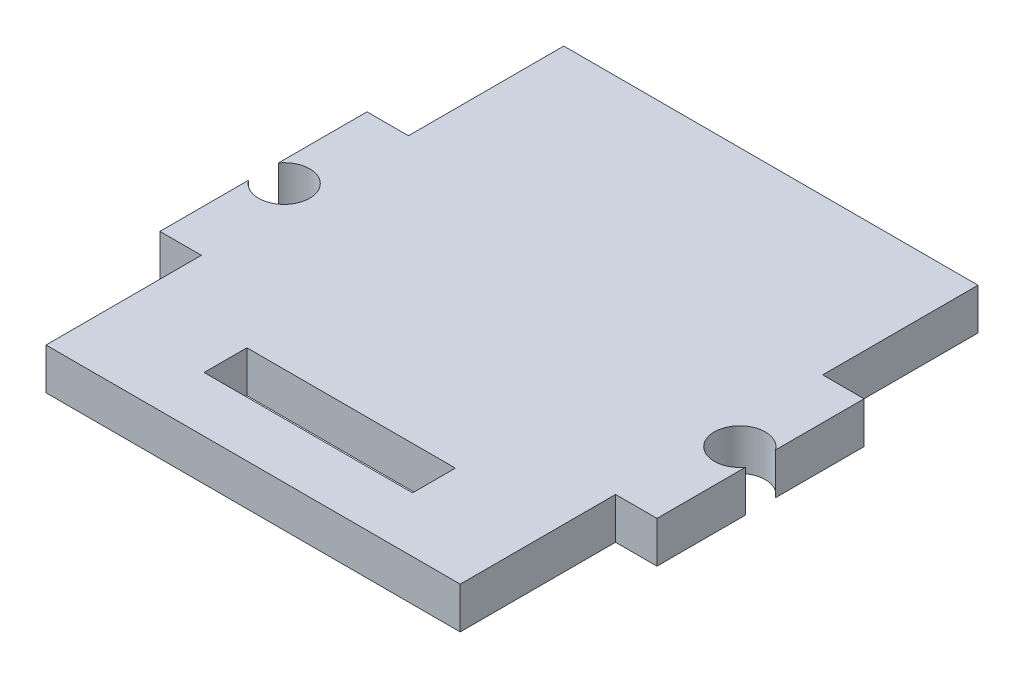
ISO-10303-21;
HEADER;
FILE_DESCRIPTION(('STEP AP214'),'2;1');
FILE_NAME('part.step','',(''),(''),'','','');
FILE_SCHEMA(('AUTOMOTIVE_DESIGN { 1 0 10303 214 1 1 1 1 }'));
ENDSEC;
DATA;
#1=APPLICATION_CONTEXT('core data for automotive mechanical design processes');
#2=APPLICATION_PROTOCOL_DEFINITION('international standard','automotive_design',2000,#1);
#3=PRODUCT_CONTEXT('',#1,'mechanical');
#4=PRODUCT('Part','Part','',(#3));
#5=PRODUCT_RELATED_PRODUCT_CATEGORY('part','',(#4));
#6=PRODUCT_DEFINITION_FORMATION('','',#4);
#7=PRODUCT_DEFINITION_CONTEXT('part definition',#1,'design');
#8=PRODUCT_DEFINITION('design','',#6,#7);
#9=PRODUCT_DEFINITION_SHAPE('','',#8);
#10=(LENGTH_UNIT() NAMED_UNIT(*) SI_UNIT(.MILLI.,.METRE.));
#11=(NAMED_UNIT(*) PLANE_ANGLE_UNIT() SI_UNIT($,.RADIAN.));
#12=(NAMED_UNIT(*) SI_UNIT($,.STERADIAN.) SOLID_ANGLE_UNIT());
#13=UNCERTAINTY_MEASURE_WITH_UNIT(LENGTH_MEASURE(1.E-05),#10,'distance_accuracy_value','');
#14=(GEOMETRIC_REPRESENTATION_CONTEXT(3) GLOBAL_UNCERTAINTY_ASSIGNED_CONTEXT((#13)) GLOBAL_UNIT_ASSIGNED_CONTEXT((#10,
#11,#12)) REPRESENTATION_CONTEXT('',''));
#15=CARTESIAN_POINT('',(0.,0.,0.));
#16=DIRECTION('',(0.,0.,1.));
#17=DIRECTION('',(1.,0.,0.));
#18=AXIS2_PLACEMENT_3D('',#15,#16,#17);
#19=CARTESIAN_POINT('',(18.,0.,7.5));
#20=DIRECTION('',(1.,0.,0.));
#21=DIRECTION('',(0.,0.,-1.));
#22=AXIS2_PLACEMENT_3D('',#19,#20,#21);
#23=PLANE('',#22);
#24=DIRECTION('',(0.,1.,0.));
#25=VECTOR('',#24,1.);
#26=CARTESIAN_POINT('',(18.,-5.00000000001367E-05,-1.08282039138535));
#27=LINE('',#26,#25);
#28=CARTESIAN_POINT('',(18.,0.,-1.08282039138535));
#29=VERTEX_POINT('',#28);
#30=CARTESIAN_POINT('',(18.,3.,-1.08282039138535));
#31=VERTEX_POINT('',#30);
#32=EDGE_CURVE('E246',#29,#31,#27,.T.);
#33=ORIENTED_EDGE('',*,*,#32,.F.);
#34=DIRECTION('',(0.,0.,-1.));
#35=VECTOR('',#34,1.);
#36=CARTESIAN_POINT('',(18.,0.,7.5));
#37=LINE('',#36,#35);
#38=CARTESIAN_POINT('',(18.,0.,-7.5));
#39=VERTEX_POINT('',#38);
#40=EDGE_CURVE('E213',#29,#39,#37,.T.);
#41=ORIENTED_EDGE('',*,*,#40,.T.);
#42=DIRECTION('',(0.,1.,0.));
#43=VECTOR('',#42,1.);
#44=CARTESIAN_POINT('',(18.,0.,-7.5));
#45=LINE('',#44,#43);
#46=CARTESIAN_POINT('',(18.,3.,-7.5));
#47=VERTEX_POINT('',#46);
#48=EDGE_CURVE('E221',#39,#47,#45,.T.);
#49=ORIENTED_EDGE('',*,*,#48,.T.);
#50=DIRECTION('',(0.,0.,-1.));
#51=VECTOR('',#50,1.);
#52=CARTESIAN_POINT('',(18.,3.,7.5));
#53=LINE('',#52,#51);
#54=EDGE_CURVE('E218',#31,#47,#53,.T.);
#55=ORIENTED_EDGE('',*,*,#54,.F.);
#56=EDGE_LOOP('',(#33,#41,#49,#55));
#57=FACE_BOUND('',#56,.T.);
#58=ADVANCED_FACE('F33',(#57),#23,.T.);
#59=CARTESIAN_POINT('',(-18.,0.,7.5));
#60=DIRECTION('',(-1.,0.,0.));
#61=DIRECTION('',(0.,0.,1.));
#62=AXIS2_PLACEMENT_3D('',#59,#60,#61);
#63=PLANE('',#62);
#64=DIRECTION('',(0.,1.,0.));
#65=VECTOR('',#64,1.);
#66=CARTESIAN_POINT('',(-18.,-5.00000000001367E-05,1.08282039138538));
#67=LINE('',#66,#65);
#68=CARTESIAN_POINT('',(-18.,0.,1.08282039138538));
#69=VERTEX_POINT('',#68);
#70=CARTESIAN_POINT('',(-18.,3.,1.08282039138538));
#71=VERTEX_POINT('',#70);
#72=EDGE_CURVE('E241',#69,#71,#67,.T.);
#73=ORIENTED_EDGE('',*,*,#72,.F.);
#74=DIRECTION('',(0.,0.,1.));
#75=VECTOR('',#74,1.);
#76=CARTESIAN_POINT('',(-18.,0.,7.5));
#77=LINE('',#76,#75);
#78=CARTESIAN_POINT('',(-18.,0.,7.5));
#79=VERTEX_POINT('',#78);
#80=EDGE_CURVE('E322',#69,#79,#77,.T.);
#81=ORIENTED_EDGE('',*,*,#80,.T.);
#82=DIRECTION('',(0.,1.,0.));
#83=VECTOR('',#82,1.);
#84=CARTESIAN_POINT('',(-18.,0.,7.5));
#85=LINE('',#84,#83);
#86=CARTESIAN_POINT('',(-18.,3.,7.5));
#87=VERTEX_POINT('',#86);
#88=EDGE_CURVE('E330',#79,#87,#85,.T.);
#89=ORIENTED_EDGE('',*,*,#88,.T.);
#90=DIRECTION('',(0.,0.,1.));
#91=VECTOR('',#90,1.);
#92=CARTESIAN_POINT('',(-18.,3.,7.5));
#93=LINE('',#92,#91);
#94=EDGE_CURVE('E327',#71,#87,#93,.T.);
#95=ORIENTED_EDGE('',*,*,#94,.F.);
#96=EDGE_LOOP('',(#73,#81,#89,#95));
#97=FACE_BOUND('',#96,.T.);
#98=ADVANCED_FACE('F271',(#97),#63,.T.);
#99=CARTESIAN_POINT('',(15.,3.,-18.75));
#100=DIRECTION('',(-1.,0.,0.));
#101=DIRECTION('',(0.,0.,1.));
#102=AXIS2_PLACEMENT_3D('',#99,#100,#101);
#103=PLANE('',#102);
#104=DIRECTION('',(0.,1.,0.));
#105=VECTOR('',#104,1.);
#106=CARTESIAN_POINT('',(15.,0.,-7.5));
#107=LINE('',#106,#105);
#108=CARTESIAN_POINT('',(15.,0.,-7.5));
#109=VERTEX_POINT('',#108);
#110=CARTESIAN_POINT('',(15.,3.,-7.5));
#111=VERTEX_POINT('',#110);
#112=EDGE_CURVE('E224',#109,#111,#107,.T.);
#113=ORIENTED_EDGE('',*,*,#112,.F.);
#114=DIRECTION('',(0.,0.,-1.));
#115=VECTOR('',#114,1.);
#116=CARTESIAN_POINT('',(15.,0.,-18.75));
#117=LINE('',#116,#115);
#118=CARTESIAN_POINT('',(15.,0.,-18.75));
#119=VERTEX_POINT('',#118);
#120=EDGE_CURVE('E336',#109,#119,#117,.T.);
#121=ORIENTED_EDGE('',*,*,#120,.T.);
#122=DIRECTION('',(0.,-1.,0.));
#123=VECTOR('',#122,1.);
#124=CARTESIAN_POINT('',(15.,3.,-18.75));
#125=LINE('',#124,#123);
#126=CARTESIAN_POINT('',(15.,3.,-18.75));
#127=VERTEX_POINT('',#126);
#128=EDGE_CURVE('E242',#127,#119,#125,.T.);
#129=ORIENTED_EDGE('',*,*,#128,.F.);
#130=DIRECTION('',(0.,0.,-1.));
#131=VECTOR('',#130,1.);
#132=CARTESIAN_POINT('',(15.,3.,-18.75));
#133=LINE('',#132,#131);
#134=EDGE_CURVE('E309',#111,#127,#133,.T.);
#135=ORIENTED_EDGE('',*,*,#134,.F.);
#136=EDGE_LOOP('',(#113,#121,#129,#135));
#137=FACE_BOUND('',#136,.T.);
#138=ADVANCED_FACE('F278',(#137),#103,.F.);
#139=CARTESIAN_POINT('',(-15.,3.,-18.75));
#140=DIRECTION('',(1.,0.,0.));
#141=DIRECTION('',(0.,0.,-1.));
#142=AXIS2_PLACEMENT_3D('',#139,#140,#141);
#143=PLANE('',#142);
#144=DIRECTION('',(0.,1.,0.));
#145=VECTOR('',#144,1.);
#146=CARTESIAN_POINT('',(-15.,0.,7.5));
#147=LINE('',#146,#145);
#148=CARTESIAN_POINT('',(-15.,0.,7.5));
#149=VERTEX_POINT('',#148);
#150=CARTESIAN_POINT('',(-15.,3.,7.5));
#151=VERTEX_POINT('',#150);
#152=EDGE_CURVE('E333',#149,#151,#147,.T.);
#153=ORIENTED_EDGE('',*,*,#152,.F.);
#154=DIRECTION('',(0.,0.,1.));
#155=VECTOR('',#154,1.);
#156=CARTESIAN_POINT('',(-15.,0.,-18.75));
#157=LINE('',#156,#155);
#158=CARTESIAN_POINT('',(-15.,0.,18.75));
#159=VERTEX_POINT('',#158);
#160=EDGE_CURVE('E360',#149,#159,#157,.T.);
#161=ORIENTED_EDGE('',*,*,#160,.T.);
#162=DIRECTION('',(0.,-1.,0.));
#163=VECTOR('',#162,1.);
#164=CARTESIAN_POINT('',(-15.,3.,18.75));
#165=LINE('',#164,#163);
#166=CARTESIAN_POINT('',(-15.,3.,18.75));
#167=VERTEX_POINT('',#166);
#168=EDGE_CURVE('E377',#167,#159,#165,.T.);
#169=ORIENTED_EDGE('',*,*,#168,.F.);
#170=DIRECTION('',(0.,0.,1.));
#171=VECTOR('',#170,1.);
#172=CARTESIAN_POINT('',(-15.,3.,-18.75));
#173=LINE('',#172,#171);
#174=EDGE_CURVE('E387',#151,#167,#173,.T.);
#175=ORIENTED_EDGE('',*,*,#174,.F.);
#176=EDGE_LOOP('',(#153,#161,#169,#175));
#177=FACE_BOUND('',#176,.T.);
#178=ADVANCED_FACE('F446',(#177),#143,.F.);
#179=CARTESIAN_POINT('',(15.,0.,18.75));
#180=VERTEX_POINT('',#179);
#181=CARTESIAN_POINT('',(15.,0.,7.50000000000001));
#182=VERTEX_POINT('',#181);
#183=EDGE_CURVE('E348',#180,#182,#117,.T.);
#184=ORIENTED_EDGE('',*,*,#183,.T.);
#185=DIRECTION('',(0.,1.,0.));
#186=VECTOR('',#185,1.);
#187=CARTESIAN_POINT('',(15.,0.,7.50000000000001));
#188=LINE('',#187,#186);
#189=CARTESIAN_POINT('',(15.,3.,7.50000000000001));
#190=VERTEX_POINT('',#189);
#191=EDGE_CURVE('E231',#182,#190,#188,.T.);
#192=ORIENTED_EDGE('',*,*,#191,.T.);
#193=CARTESIAN_POINT('',(15.,3.,18.75));
#194=VERTEX_POINT('',#193);
#195=EDGE_CURVE('E304',#194,#190,#133,.T.);
#196=ORIENTED_EDGE('',*,*,#195,.F.);
#197=DIRECTION('',(0.,-1.,0.));
#198=VECTOR('',#197,1.);
#199=CARTESIAN_POINT('',(15.,3.,18.75));
#200=LINE('',#199,#198);
#201=EDGE_CURVE('E379',#194,#180,#200,.T.);
#202=ORIENTED_EDGE('',*,*,#201,.T.);
#203=EDGE_LOOP('',(#184,#192,#196,#202));
#204=FACE_BOUND('',#203,.T.);
#205=ADVANCED_FACE('F35',(#204),#103,.F.);
#206=CARTESIAN_POINT('',(-15.,3.,-18.75));
#207=DIRECTION('',(0.,0.,1.));
#208=DIRECTION('',(1.,0.,0.));
#209=AXIS2_PLACEMENT_3D('',#206,#207,#208);
#210=PLANE('',#209);
#211=DIRECTION('',(-1.,0.,0.));
#212=VECTOR('',#211,1.);
#213=CARTESIAN_POINT('',(-15.,0.,-18.75));
#214=LINE('',#213,#212);
#215=CARTESIAN_POINT('',(-15.,0.,-18.75));
#216=VERTEX_POINT('',#215);
#217=EDGE_CURVE('E352',#119,#216,#214,.T.);
#218=ORIENTED_EDGE('',*,*,#217,.T.);
#219=DIRECTION('',(0.,-1.,0.));
#220=VECTOR('',#219,1.);
#221=CARTESIAN_POINT('',(-15.,3.,-18.75));
#222=LINE('',#221,#220);
#223=CARTESIAN_POINT('',(-15.,3.,-18.75));
#224=VERTEX_POINT('',#223);
#225=EDGE_CURVE('E374',#224,#216,#222,.T.);
#226=ORIENTED_EDGE('',*,*,#225,.F.);
#227=DIRECTION('',(-1.,0.,0.));
#228=VECTOR('',#227,1.);
#229=CARTESIAN_POINT('',(-15.,3.,-18.75));
#230=LINE('',#229,#228);
#231=EDGE_CURVE('E390',#127,#224,#230,.T.);
#232=ORIENTED_EDGE('',*,*,#231,.F.);
#233=ORIENTED_EDGE('',*,*,#128,.T.);
#234=EDGE_LOOP('',(#218,#226,#232,#233));
#235=FACE_BOUND('',#234,.T.);
#236=ADVANCED_FACE('F422',(#235),#210,.F.);
#237=CARTESIAN_POINT('',(-15.,0.,-7.5));
#238=VERTEX_POINT('',#237);
#239=EDGE_CURVE('E369',#216,#238,#157,.T.);
#240=ORIENTED_EDGE('',*,*,#239,.T.);
#241=DIRECTION('',(0.,1.,0.));
#242=VECTOR('',#241,1.);
#243=CARTESIAN_POINT('',(-15.,0.,-7.5));
#244=LINE('',#243,#242);
#245=CARTESIAN_POINT('',(-15.,3.,-7.5));
#246=VERTEX_POINT('',#245);
#247=EDGE_CURVE('E340',#238,#246,#244,.T.);
#248=ORIENTED_EDGE('',*,*,#247,.T.);
#249=EDGE_CURVE('E384',#224,#246,#173,.T.);
#250=ORIENTED_EDGE('',*,*,#249,.F.);
#251=ORIENTED_EDGE('',*,*,#225,.T.);
#252=EDGE_LOOP('',(#240,#248,#250,#251));
#253=FACE_BOUND('',#252,.T.);
#254=ADVANCED_FACE('F426',(#253),#143,.F.);
#255=CARTESIAN_POINT('',(-15.,3.,18.75));
#256=DIRECTION('',(0.,0.,-1.));
#257=DIRECTION('',(-1.,0.,0.));
#258=AXIS2_PLACEMENT_3D('',#255,#256,#257);
#259=PLANE('',#258);
#260=DIRECTION('',(1.,0.,0.));
#261=VECTOR('',#260,1.);
#262=CARTESIAN_POINT('',(-15.,0.,18.75));
#263=LINE('',#262,#261);
#264=EDGE_CURVE('E363',#159,#180,#263,.T.);
#265=ORIENTED_EDGE('',*,*,#264,.T.);
#266=ORIENTED_EDGE('',*,*,#201,.F.);
#267=DIRECTION('',(1.,0.,0.));
#268=VECTOR('',#267,1.);
#269=CARTESIAN_POINT('',(-15.,3.,18.75));
#270=LINE('',#269,#268);
#271=EDGE_CURVE('E356',#167,#194,#270,.T.);
#272=ORIENTED_EDGE('',*,*,#271,.F.);
#273=ORIENTED_EDGE('',*,*,#168,.T.);
#274=EDGE_LOOP('',(#265,#266,#272,#273));
#275=FACE_BOUND('',#274,.T.);
#276=ADVANCED_FACE('F404',(#275),#259,.F.);
#277=CARTESIAN_POINT('',(0.,3.,0.));
#278=DIRECTION('',(0.,1.,0.));
#279=DIRECTION('',(0.,0.,1.));
#280=AXIS2_PLACEMENT_3D('',#277,#278,#279);
#281=PLANE('',#280);
#282=DIRECTION('',(0.,0.,1.));
#283=VECTOR('',#282,1.);
#284=CARTESIAN_POINT('',(-7.55,3.,14.75));
#285=LINE('',#284,#283);
#286=CARTESIAN_POINT('',(-7.55,3.,11.65));
#287=VERTEX_POINT('',#286);
#288=CARTESIAN_POINT('',(-7.55,3.,14.75));
#289=VERTEX_POINT('',#288);
#290=EDGE_CURVE('E48',#287,#289,#285,.T.);
#291=ORIENTED_EDGE('',*,*,#290,.F.);
#292=DIRECTION('',(-1.,0.,0.));
#293=VECTOR('',#292,1.);
#294=CARTESIAN_POINT('',(-7.55,3.,11.65));
#295=LINE('',#294,#293);
#296=CARTESIAN_POINT('',(7.55,3.,11.65));
#297=VERTEX_POINT('',#296);
#298=EDGE_CURVE('E189',#297,#287,#295,.T.);
#299=ORIENTED_EDGE('',*,*,#298,.F.);
#300=DIRECTION('',(0.,0.,-1.));
#301=VECTOR('',#300,1.);
#302=CARTESIAN_POINT('',(7.55,3.,14.75));
#303=LINE('',#302,#301);
#304=CARTESIAN_POINT('',(7.55,3.,14.75));
#305=VERTEX_POINT('',#304);
#306=EDGE_CURVE('E173',#305,#297,#303,.T.);
#307=ORIENTED_EDGE('',*,*,#306,.F.);
#308=DIRECTION('',(1.,0.,0.));
#309=VECTOR('',#308,1.);
#310=CARTESIAN_POINT('',(-7.55,3.,14.75));
#311=LINE('',#310,#309);
#312=EDGE_CURVE('E182',#289,#305,#311,.T.);
#313=ORIENTED_EDGE('',*,*,#312,.F.);
#314=EDGE_LOOP('',(#291,#299,#307,#313));
#315=FACE_BOUND('',#314,.T.);
#316=CARTESIAN_POINT('',(16.5,3.,0.));
#317=DIRECTION('',(0.,1.,0.));
#318=DIRECTION('',(0.,0.,1.));
#319=AXIS2_PLACEMENT_3D('',#316,#317,#318);
#320=CIRCLE('',#319,1.85);
#321=CARTESIAN_POINT('',(18.,3.,1.08282039138535));
#322=VERTEX_POINT('',#321);
#323=EDGE_CURVE('E196',#31,#322,#320,.T.);
#324=ORIENTED_EDGE('',*,*,#323,.F.);
#325=ORIENTED_EDGE('',*,*,#54,.T.);
#326=DIRECTION('',(-1.,0.,0.));
#327=VECTOR('',#326,1.);
#328=CARTESIAN_POINT('',(15.,3.,-7.5));
#329=LINE('',#328,#327);
#330=EDGE_CURVE('E217',#47,#111,#329,.T.);
#331=ORIENTED_EDGE('',*,*,#330,.T.);
#332=ORIENTED_EDGE('',*,*,#134,.T.);
#333=ORIENTED_EDGE('',*,*,#231,.T.);
#334=ORIENTED_EDGE('',*,*,#249,.T.);
#335=DIRECTION('',(-1.,0.,0.));
#336=VECTOR('',#335,1.);
#337=CARTESIAN_POINT('',(-15.,3.,-7.5));
#338=LINE('',#337,#336);
#339=CARTESIAN_POINT('',(-18.,3.,-7.5));
#340=VERTEX_POINT('',#339);
#341=EDGE_CURVE('E227',#246,#340,#338,.T.);
#342=ORIENTED_EDGE('',*,*,#341,.T.);
#343=CARTESIAN_POINT('',(-18.,3.,-1.08282039138538));
#344=VERTEX_POINT('',#343);
#345=EDGE_CURVE('E323',#340,#344,#93,.T.);
#346=ORIENTED_EDGE('',*,*,#345,.T.);
#347=CARTESIAN_POINT('',(-16.5,3.,0.));
#348=DIRECTION('',(0.,1.,0.));
#349=DIRECTION('',(0.,0.,1.));
#350=AXIS2_PLACEMENT_3D('',#347,#348,#349);
#351=CIRCLE('',#350,1.85);
#352=EDGE_CURVE('E203',#71,#344,#351,.T.);
#353=ORIENTED_EDGE('',*,*,#352,.F.);
#354=ORIENTED_EDGE('',*,*,#94,.T.);
#355=DIRECTION('',(1.,0.,0.));
#356=VECTOR('',#355,1.);
#357=CARTESIAN_POINT('',(-15.,3.,7.5));
#358=LINE('',#357,#356);
#359=EDGE_CURVE('E326',#87,#151,#358,.T.);
#360=ORIENTED_EDGE('',*,*,#359,.T.);
#361=ORIENTED_EDGE('',*,*,#174,.T.);
#362=ORIENTED_EDGE('',*,*,#271,.T.);
#363=ORIENTED_EDGE('',*,*,#195,.T.);
#364=DIRECTION('',(1.,0.,0.));
#365=VECTOR('',#364,1.);
#366=CARTESIAN_POINT('',(15.,3.,7.50000000000001));
#367=LINE('',#366,#365);
#368=CARTESIAN_POINT('',(18.,3.,7.5));
#369=VERTEX_POINT('',#368);
#370=EDGE_CURVE('E208',#190,#369,#367,.T.);
#371=ORIENTED_EDGE('',*,*,#370,.T.);
#372=EDGE_CURVE('E214',#369,#322,#53,.T.);
#373=ORIENTED_EDGE('',*,*,#372,.T.);
#374=EDGE_LOOP('',(#324,#325,#331,#332,#333,#334,#342,#346,#353,#354,#360,#361,#362,#363,#371,#373));
#375=FACE_BOUND('',#374,.T.);
#376=ADVANCED_FACE('F186',(#315,#375),#281,.T.);
#377=CARTESIAN_POINT('',(0.,0.,0.));
#378=DIRECTION('',(0.,1.,0.));
#379=DIRECTION('',(0.,0.,1.));
#380=AXIS2_PLACEMENT_3D('',#377,#378,#379);
#381=PLANE('',#380);
#382=DIRECTION('',(-1.,0.,0.));
#383=VECTOR('',#382,1.);
#384=CARTESIAN_POINT('',(0.,0.,11.65));
#385=LINE('',#384,#383);
#386=CARTESIAN_POINT('',(7.55,0.,11.65));
#387=VERTEX_POINT('',#386);
#388=CARTESIAN_POINT('',(-7.55,0.,11.65));
#389=VERTEX_POINT('',#388);
#390=EDGE_CURVE('E41',#387,#389,#385,.T.);
#391=ORIENTED_EDGE('',*,*,#390,.T.);
#392=DIRECTION('',(0.,0.,1.));
#393=VECTOR('',#392,1.);
#394=CARTESIAN_POINT('',(-7.55,0.,0.));
#395=LINE('',#394,#393);
#396=CARTESIAN_POINT('',(-7.55,0.,14.75));
#397=VERTEX_POINT('',#396);
#398=EDGE_CURVE('E11',#389,#397,#395,.T.);
#399=ORIENTED_EDGE('',*,*,#398,.T.);
#400=DIRECTION('',(1.,0.,0.));
#401=VECTOR('',#400,1.);
#402=CARTESIAN_POINT('',(0.,0.,14.75));
#403=LINE('',#402,#401);
#404=CARTESIAN_POINT('',(7.55,0.,14.75));
#405=VERTEX_POINT('',#404);
#406=EDGE_CURVE('E248',#397,#405,#403,.T.);
#407=ORIENTED_EDGE('',*,*,#406,.T.);
#408=DIRECTION('',(0.,0.,-1.));
#409=VECTOR('',#408,1.);
#410=CARTESIAN_POINT('',(7.54999999999999,0.,0.));
#411=LINE('',#410,#409);
#412=EDGE_CURVE('E176',#405,#387,#411,.T.);
#413=ORIENTED_EDGE('',*,*,#412,.T.);
#414=EDGE_LOOP('',(#391,#399,#407,#413));
#415=FACE_BOUND('',#414,.T.);
#416=ORIENTED_EDGE('',*,*,#40,.F.);
#417=CARTESIAN_POINT('',(16.5,0.,0.));
#418=DIRECTION('',(0.,1.,0.));
#419=DIRECTION('',(0.,0.,1.));
#420=AXIS2_PLACEMENT_3D('',#417,#418,#419);
#421=CIRCLE('',#420,1.85);
#422=CARTESIAN_POINT('',(18.,0.,1.08282039138535));
#423=VERTEX_POINT('',#422);
#424=EDGE_CURVE('E200',#29,#423,#421,.T.);
#425=ORIENTED_EDGE('',*,*,#424,.T.);
#426=CARTESIAN_POINT('',(18.,0.,7.5));
#427=VERTEX_POINT('',#426);
#428=EDGE_CURVE('E209',#427,#423,#37,.T.);
#429=ORIENTED_EDGE('',*,*,#428,.F.);
#430=DIRECTION('',(1.,0.,0.));
#431=VECTOR('',#430,1.);
#432=CARTESIAN_POINT('',(15.,0.,7.50000000000001));
#433=LINE('',#432,#431);
#434=EDGE_CURVE('E236',#182,#427,#433,.T.);
#435=ORIENTED_EDGE('',*,*,#434,.F.);
#436=ORIENTED_EDGE('',*,*,#183,.F.);
#437=ORIENTED_EDGE('',*,*,#264,.F.);
#438=ORIENTED_EDGE('',*,*,#160,.F.);
#439=DIRECTION('',(1.,0.,0.));
#440=VECTOR('',#439,1.);
#441=CARTESIAN_POINT('',(-15.,0.,7.5));
#442=LINE('',#441,#440);
#443=EDGE_CURVE('E321',#79,#149,#442,.T.);
#444=ORIENTED_EDGE('',*,*,#443,.F.);
#445=ORIENTED_EDGE('',*,*,#80,.F.);
#446=CARTESIAN_POINT('',(-16.5,0.,0.));
#447=DIRECTION('',(0.,1.,0.));
#448=DIRECTION('',(0.,0.,1.));
#449=AXIS2_PLACEMENT_3D('',#446,#447,#448);
#450=CIRCLE('',#449,1.85);
#451=CARTESIAN_POINT('',(-18.,0.,-1.08282039138538));
#452=VERTEX_POINT('',#451);
#453=EDGE_CURVE('E205',#69,#452,#450,.T.);
#454=ORIENTED_EDGE('',*,*,#453,.T.);
#455=CARTESIAN_POINT('',(-18.,0.,-7.5));
#456=VERTEX_POINT('',#455);
#457=EDGE_CURVE('E318',#456,#452,#77,.T.);
#458=ORIENTED_EDGE('',*,*,#457,.F.);
#459=DIRECTION('',(-1.,0.,0.));
#460=VECTOR('',#459,1.);
#461=CARTESIAN_POINT('',(-15.,0.,-7.5));
#462=LINE('',#461,#460);
#463=EDGE_CURVE('E345',#238,#456,#462,.T.);
#464=ORIENTED_EDGE('',*,*,#463,.F.);
#465=ORIENTED_EDGE('',*,*,#239,.F.);
#466=ORIENTED_EDGE('',*,*,#217,.F.);
#467=ORIENTED_EDGE('',*,*,#120,.F.);
#468=DIRECTION('',(-1.,0.,0.));
#469=VECTOR('',#468,1.);
#470=CARTESIAN_POINT('',(15.,0.,-7.5));
#471=LINE('',#470,#469);
#472=EDGE_CURVE('E212',#39,#109,#471,.T.);
#473=ORIENTED_EDGE('',*,*,#472,.F.);
#474=EDGE_LOOP('',(#416,#425,#429,#435,#436,#437,#438,#444,#445,#454,#458,#464,#465,#466,#467,#473));
#475=FACE_BOUND('',#474,.T.);
#476=ADVANCED_FACE('F252',(#415,#475),#381,.F.);
#477=CARTESIAN_POINT('',(-15.,0.,7.5));
#478=DIRECTION('',(0.,0.,1.));
#479=DIRECTION('',(1.,0.,0.));
#480=AXIS2_PLACEMENT_3D('',#477,#478,#479);
#481=PLANE('',#480);
#482=ORIENTED_EDGE('',*,*,#359,.F.);
#483=ORIENTED_EDGE('',*,*,#88,.F.);
#484=ORIENTED_EDGE('',*,*,#443,.T.);
#485=ORIENTED_EDGE('',*,*,#152,.T.);
#486=EDGE_LOOP('',(#482,#483,#484,#485));
#487=FACE_BOUND('',#486,.T.);
#488=ADVANCED_FACE('F441',(#487),#481,.T.);
#489=DIRECTION('',(0.,1.,0.));
#490=VECTOR('',#489,1.);
#491=CARTESIAN_POINT('',(-18.,-5.00000000001367E-05,-1.08282039138538));
#492=LINE('',#491,#490);
#493=EDGE_CURVE('E239',#344,#452,#492,.F.);
#494=ORIENTED_EDGE('',*,*,#493,.F.);
#495=ORIENTED_EDGE('',*,*,#345,.F.);
#496=DIRECTION('',(0.,1.,0.));
#497=VECTOR('',#496,1.);
#498=CARTESIAN_POINT('',(-18.,0.,-7.5));
#499=LINE('',#498,#497);
#500=EDGE_CURVE('E430',#456,#340,#499,.T.);
#501=ORIENTED_EDGE('',*,*,#500,.F.);
#502=ORIENTED_EDGE('',*,*,#457,.T.);
#503=EDGE_LOOP('',(#494,#495,#501,#502));
#504=FACE_BOUND('',#503,.T.);
#505=ADVANCED_FACE('F281',(#504),#63,.T.);
#506=CARTESIAN_POINT('',(-15.,0.,-7.5));
#507=DIRECTION('',(0.,0.,-1.));
#508=DIRECTION('',(-1.,0.,0.));
#509=AXIS2_PLACEMENT_3D('',#506,#507,#508);
#510=PLANE('',#509);
#511=ORIENTED_EDGE('',*,*,#341,.F.);
#512=ORIENTED_EDGE('',*,*,#247,.F.);
#513=ORIENTED_EDGE('',*,*,#463,.T.);
#514=ORIENTED_EDGE('',*,*,#500,.T.);
#515=EDGE_LOOP('',(#511,#512,#513,#514));
#516=FACE_BOUND('',#515,.T.);
#517=ADVANCED_FACE('F294',(#516),#510,.T.);
#518=CARTESIAN_POINT('',(15.,0.,-7.5));
#519=DIRECTION('',(0.,0.,-1.));
#520=DIRECTION('',(-1.,0.,0.));
#521=AXIS2_PLACEMENT_3D('',#518,#519,#520);
#522=PLANE('',#521);
#523=ORIENTED_EDGE('',*,*,#330,.F.);
#524=ORIENTED_EDGE('',*,*,#48,.F.);
#525=ORIENTED_EDGE('',*,*,#472,.T.);
#526=ORIENTED_EDGE('',*,*,#112,.T.);
#527=EDGE_LOOP('',(#523,#524,#525,#526));
#528=FACE_BOUND('',#527,.T.);
#529=ADVANCED_FACE('F287',(#528),#522,.T.);
#530=DIRECTION('',(0.,1.,0.));
#531=VECTOR('',#530,1.);
#532=CARTESIAN_POINT('',(18.,-5.00000000001367E-05,1.08282039138535));
#533=LINE('',#532,#531);
#534=EDGE_CURVE('E244',#322,#423,#533,.F.);
#535=ORIENTED_EDGE('',*,*,#534,.F.);
#536=ORIENTED_EDGE('',*,*,#372,.F.);
#537=DIRECTION('',(0.,1.,0.));
#538=VECTOR('',#537,1.);
#539=CARTESIAN_POINT('',(18.,0.,7.5));
#540=LINE('',#539,#538);
#541=EDGE_CURVE('E315',#427,#369,#540,.T.);
#542=ORIENTED_EDGE('',*,*,#541,.F.);
#543=ORIENTED_EDGE('',*,*,#428,.T.);
#544=EDGE_LOOP('',(#535,#536,#542,#543));
#545=FACE_BOUND('',#544,.T.);
#546=ADVANCED_FACE('F274',(#545),#23,.T.);
#547=CARTESIAN_POINT('',(15.,0.,7.50000000000001));
#548=DIRECTION('',(0.,0.,1.));
#549=DIRECTION('',(1.,0.,0.));
#550=AXIS2_PLACEMENT_3D('',#547,#548,#549);
#551=PLANE('',#550);
#552=ORIENTED_EDGE('',*,*,#370,.F.);
#553=ORIENTED_EDGE('',*,*,#191,.F.);
#554=ORIENTED_EDGE('',*,*,#434,.T.);
#555=ORIENTED_EDGE('',*,*,#541,.T.);
#556=EDGE_LOOP('',(#552,#553,#554,#555));
#557=FACE_BOUND('',#556,.T.);
#558=ADVANCED_FACE('F286',(#557),#551,.T.);
#559=CARTESIAN_POINT('',(-16.5,-5.00000000001367E-05,0.));
#560=DIRECTION('',(0.,1.,0.));
#561=DIRECTION('',(0.,0.,1.));
#562=AXIS2_PLACEMENT_3D('',#559,#560,#561);
#563=CYLINDRICAL_SURFACE('',#562,1.85);
#564=ORIENTED_EDGE('',*,*,#72,.T.);
#565=ORIENTED_EDGE('',*,*,#352,.T.);
#566=ORIENTED_EDGE('',*,*,#493,.T.);
#567=ORIENTED_EDGE('',*,*,#453,.F.);
#568=EDGE_LOOP('',(#564,#565,#566,#567));
#569=FACE_BOUND('',#568,.T.);
#570=ADVANCED_FACE('F266',(#569),#563,.F.);
#571=CARTESIAN_POINT('',(16.5,-5.00000000001367E-05,0.));
#572=DIRECTION('',(0.,1.,0.));
#573=DIRECTION('',(0.,0.,1.));
#574=AXIS2_PLACEMENT_3D('',#571,#572,#573);
#575=CYLINDRICAL_SURFACE('',#574,1.85);
#576=ORIENTED_EDGE('',*,*,#32,.T.);
#577=ORIENTED_EDGE('',*,*,#323,.T.);
#578=ORIENTED_EDGE('',*,*,#534,.T.);
#579=ORIENTED_EDGE('',*,*,#424,.F.);
#580=EDGE_LOOP('',(#576,#577,#578,#579));
#581=FACE_BOUND('',#580,.T.);
#582=ADVANCED_FACE('F259',(#581),#575,.F.);
#583=CARTESIAN_POINT('',(-7.55,-5.00000000001367E-05,14.75));
#584=DIRECTION('',(-1.,0.,0.));
#585=DIRECTION('',(0.,0.,1.));
#586=AXIS2_PLACEMENT_3D('',#583,#584,#585);
#587=PLANE('',#586);
#588=DIRECTION('',(0.,1.,0.));
#589=VECTOR('',#588,1.);
#590=CARTESIAN_POINT('',(-7.55,-5.00000000001367E-05,11.65));
#591=LINE('',#590,#589);
#592=EDGE_CURVE('E194',#389,#287,#591,.T.);
#593=ORIENTED_EDGE('',*,*,#592,.T.);
#594=ORIENTED_EDGE('',*,*,#290,.T.);
#595=DIRECTION('',(0.,1.,0.));
#596=VECTOR('',#595,1.);
#597=CARTESIAN_POINT('',(-7.55,-5.00000000001367E-05,14.75));
#598=LINE('',#597,#596);
#599=EDGE_CURVE('E179',#397,#289,#598,.T.);
#600=ORIENTED_EDGE('',*,*,#599,.F.);
#601=ORIENTED_EDGE('',*,*,#398,.F.);
#602=EDGE_LOOP('',(#593,#594,#600,#601));
#603=FACE_BOUND('',#602,.T.);
#604=ADVANCED_FACE('F257',(#603),#587,.F.);
#605=CARTESIAN_POINT('',(-7.55,-5.00000000001367E-05,11.65));
#606=DIRECTION('',(0.,0.,-1.));
#607=DIRECTION('',(-1.,0.,0.));
#608=AXIS2_PLACEMENT_3D('',#605,#606,#607);
#609=PLANE('',#608);
#610=DIRECTION('',(0.,1.,0.));
#611=VECTOR('',#610,1.);
#612=CARTESIAN_POINT('',(7.55,-5.00000000001367E-05,11.65));
#613=LINE('',#612,#611);
#614=EDGE_CURVE('E178',#387,#297,#613,.T.);
#615=ORIENTED_EDGE('',*,*,#614,.T.);
#616=ORIENTED_EDGE('',*,*,#298,.T.);
#617=ORIENTED_EDGE('',*,*,#592,.F.);
#618=ORIENTED_EDGE('',*,*,#390,.F.);
#619=EDGE_LOOP('',(#615,#616,#617,#618));
#620=FACE_BOUND('',#619,.T.);
#621=ADVANCED_FACE('F256',(#620),#609,.F.);
#622=CARTESIAN_POINT('',(7.55,-5.00000000001367E-05,14.75));
#623=DIRECTION('',(1.,0.,0.));
#624=DIRECTION('',(0.,0.,-1.));
#625=AXIS2_PLACEMENT_3D('',#622,#623,#624);
#626=PLANE('',#625);
#627=DIRECTION('',(0.,1.,0.));
#628=VECTOR('',#627,1.);
#629=CARTESIAN_POINT('',(7.55,-5.00000000001367E-05,14.75));
#630=LINE('',#629,#628);
#631=EDGE_CURVE('E56',#405,#305,#630,.T.);
#632=ORIENTED_EDGE('',*,*,#631,.T.);
#633=ORIENTED_EDGE('',*,*,#306,.T.);
#634=ORIENTED_EDGE('',*,*,#614,.F.);
#635=ORIENTED_EDGE('',*,*,#412,.F.);
#636=EDGE_LOOP('',(#632,#633,#634,#635));
#637=FACE_BOUND('',#636,.T.);
#638=ADVANCED_FACE('F170',(#637),#626,.F.);
#639=CARTESIAN_POINT('',(-7.55,-5.00000000001367E-05,14.75));
#640=DIRECTION('',(0.,0.,1.));
#641=DIRECTION('',(1.,0.,0.));
#642=AXIS2_PLACEMENT_3D('',#639,#640,#641);
#643=PLANE('',#642);
#644=ORIENTED_EDGE('',*,*,#599,.T.);
#645=ORIENTED_EDGE('',*,*,#312,.T.);
#646=ORIENTED_EDGE('',*,*,#631,.F.);
#647=ORIENTED_EDGE('',*,*,#406,.F.);
#648=EDGE_LOOP('',(#644,#645,#646,#647));
#649=FACE_BOUND('',#648,.T.);
#650=ADVANCED_FACE('F183',(#649),#643,.F.);
#651=CLOSED_SHELL('',(#58,#98,#138,#178,#205,#236,#254,#276,#376,#476,#488,#505,#517,#529,#546,
#558,#570,#582,#604,#621,#638,#650));
#652=MANIFOLD_SOLID_BREP('B2',#651);
#653=ADVANCED_BREP_SHAPE_REPRESENTATION('',(#18,#652),#14);
#654=SHAPE_DEFINITION_REPRESENTATION(#9,#653);
ENDSEC;
END-ISO-10303-21;
